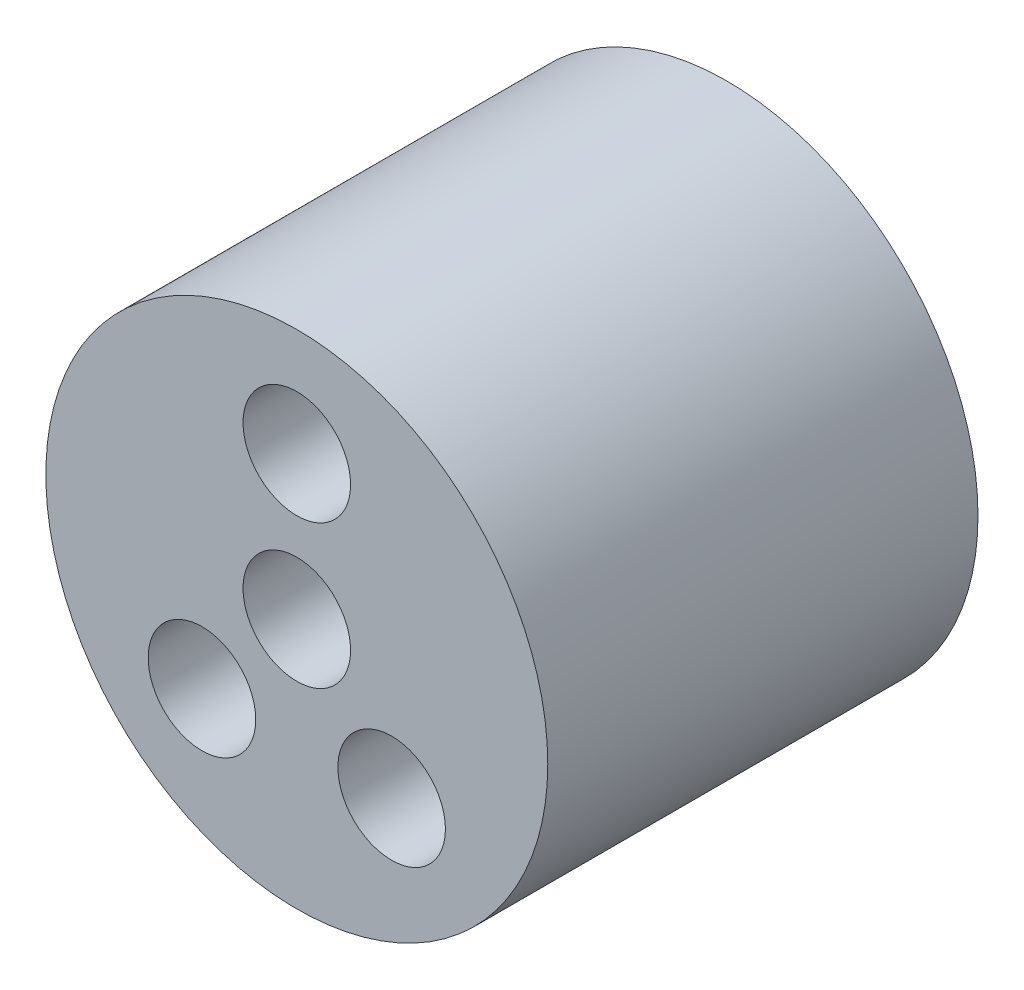
ISO-10303-21;
HEADER;
FILE_DESCRIPTION(('STEP AP214'),'2;1');
FILE_NAME('part.step','',(''),(''),'','','');
FILE_SCHEMA(('AUTOMOTIVE_DESIGN { 1 0 10303 214 1 1 1 1 }'));
ENDSEC;
DATA;
#1=APPLICATION_CONTEXT('core data for automotive mechanical design processes');
#2=APPLICATION_PROTOCOL_DEFINITION('international standard','automotive_design',2000,#1);
#3=PRODUCT_CONTEXT('',#1,'mechanical');
#4=PRODUCT('Part','Part','',(#3));
#5=PRODUCT_RELATED_PRODUCT_CATEGORY('part','',(#4));
#6=PRODUCT_DEFINITION_FORMATION('','',#4);
#7=PRODUCT_DEFINITION_CONTEXT('part definition',#1,'design');
#8=PRODUCT_DEFINITION('design','',#6,#7);
#9=PRODUCT_DEFINITION_SHAPE('','',#8);
#10=(LENGTH_UNIT() NAMED_UNIT(*) SI_UNIT(.MILLI.,.METRE.));
#11=(NAMED_UNIT(*) PLANE_ANGLE_UNIT() SI_UNIT($,.RADIAN.));
#12=(NAMED_UNIT(*) SI_UNIT($,.STERADIAN.) SOLID_ANGLE_UNIT());
#13=UNCERTAINTY_MEASURE_WITH_UNIT(LENGTH_MEASURE(1.E-05),#10,'distance_accuracy_value','');
#14=(GEOMETRIC_REPRESENTATION_CONTEXT(3) GLOBAL_UNCERTAINTY_ASSIGNED_CONTEXT((#13)) GLOBAL_UNIT_ASSIGNED_CONTEXT((#10,
#11,#12)) REPRESENTATION_CONTEXT('',''));
#15=CARTESIAN_POINT('',(0.,0.,0.));
#16=DIRECTION('',(0.,0.,1.));
#17=DIRECTION('',(1.,0.,0.));
#18=AXIS2_PLACEMENT_3D('',#15,#16,#17);
#19=CARTESIAN_POINT('',(0.,0.,240.));
#20=DIRECTION('',(0.,0.,1.));
#21=DIRECTION('',(1.,0.,0.));
#22=AXIS2_PLACEMENT_3D('',#19,#20,#21);
#23=PLANE('',#22);
#24=CARTESIAN_POINT('',(52.9150262212918,-60.,240.));
#25=DIRECTION('',(0.,0.,1.));
#26=DIRECTION('',(1.,0.,0.));
#27=AXIS2_PLACEMENT_3D('',#24,#25,#26);
#28=CIRCLE('',#27,30.);
#29=CARTESIAN_POINT('',(82.9150262212918,-60.,240.));
#30=VERTEX_POINT('',#29);
#31=EDGE_CURVE('E53',#30,#30,#28,.T.);
#32=ORIENTED_EDGE('',*,*,#31,.F.);
#33=EDGE_LOOP('',(#32));
#34=FACE_BOUND('',#33,.T.);
#35=CARTESIAN_POINT('',(0.,0.,240.));
#36=DIRECTION('',(0.,0.,1.));
#37=DIRECTION('',(1.,0.,0.));
#38=AXIS2_PLACEMENT_3D('',#35,#36,#37);
#39=CIRCLE('',#38,30.);
#40=CARTESIAN_POINT('',(30.,0.,240.));
#41=VERTEX_POINT('',#40);
#42=EDGE_CURVE('E42',#41,#41,#39,.T.);
#43=ORIENTED_EDGE('',*,*,#42,.F.);
#44=EDGE_LOOP('',(#43));
#45=FACE_BOUND('',#44,.T.);
#46=CARTESIAN_POINT('',(0.,0.,240.));
#47=DIRECTION('',(0.,0.,1.));
#48=DIRECTION('',(1.,0.,0.));
#49=AXIS2_PLACEMENT_3D('',#46,#47,#48);
#50=CIRCLE('',#49,140.);
#51=CARTESIAN_POINT('',(140.,0.,240.));
#52=VERTEX_POINT('',#51);
#53=EDGE_CURVE('E10',#52,#52,#50,.T.);
#54=ORIENTED_EDGE('',*,*,#53,.T.);
#55=EDGE_LOOP('',(#54));
#56=FACE_BOUND('',#55,.T.);
#57=CARTESIAN_POINT('',(0.,80.,240.));
#58=DIRECTION('',(0.,0.,1.));
#59=DIRECTION('',(1.,0.,0.));
#60=AXIS2_PLACEMENT_3D('',#57,#58,#59);
#61=CIRCLE('',#60,30.);
#62=CARTESIAN_POINT('',(30.,80.,240.));
#63=VERTEX_POINT('',#62);
#64=EDGE_CURVE('E47',#63,#63,#61,.T.);
#65=ORIENTED_EDGE('',*,*,#64,.F.);
#66=EDGE_LOOP('',(#65));
#67=FACE_BOUND('',#66,.T.);
#68=CARTESIAN_POINT('',(-52.9150262212918,-60.,240.));
#69=DIRECTION('',(0.,0.,1.));
#70=DIRECTION('',(1.,0.,0.));
#71=AXIS2_PLACEMENT_3D('',#68,#69,#70);
#72=CIRCLE('',#71,30.);
#73=CARTESIAN_POINT('',(-22.9150262212918,-60.,240.));
#74=VERTEX_POINT('',#73);
#75=EDGE_CURVE('E59',#74,#74,#72,.T.);
#76=ORIENTED_EDGE('',*,*,#75,.F.);
#77=EDGE_LOOP('',(#76));
#78=FACE_BOUND('',#77,.T.);
#79=ADVANCED_FACE('F31',(#34,#45,#56,#67,#78),#23,.T.);
#80=CARTESIAN_POINT('',(0.,0.,0.));
#81=DIRECTION('',(0.,0.,1.));
#82=DIRECTION('',(1.,0.,0.));
#83=AXIS2_PLACEMENT_3D('',#80,#81,#82);
#84=PLANE('',#83);
#85=CARTESIAN_POINT('',(0.,0.,0.));
#86=DIRECTION('',(0.,0.,1.));
#87=DIRECTION('',(1.,0.,0.));
#88=AXIS2_PLACEMENT_3D('',#85,#86,#87);
#89=CIRCLE('',#88,140.);
#90=CARTESIAN_POINT('',(140.,0.,0.));
#91=VERTEX_POINT('',#90);
#92=EDGE_CURVE('E35',#91,#91,#89,.T.);
#93=ORIENTED_EDGE('',*,*,#92,.F.);
#94=EDGE_LOOP('',(#93));
#95=FACE_BOUND('',#94,.T.);
#96=CARTESIAN_POINT('',(0.,0.,0.));
#97=DIRECTION('',(0.,0.,1.));
#98=DIRECTION('',(1.,0.,0.));
#99=AXIS2_PLACEMENT_3D('',#96,#97,#98);
#100=CIRCLE('',#99,30.);
#101=CARTESIAN_POINT('',(30.,0.,0.));
#102=VERTEX_POINT('',#101);
#103=EDGE_CURVE('E44',#102,#102,#100,.T.);
#104=ORIENTED_EDGE('',*,*,#103,.T.);
#105=EDGE_LOOP('',(#104));
#106=FACE_BOUND('',#105,.T.);
#107=CARTESIAN_POINT('',(0.,80.,0.));
#108=DIRECTION('',(0.,0.,1.));
#109=DIRECTION('',(1.,0.,0.));
#110=AXIS2_PLACEMENT_3D('',#107,#108,#109);
#111=CIRCLE('',#110,30.);
#112=CARTESIAN_POINT('',(30.,80.,0.));
#113=VERTEX_POINT('',#112);
#114=EDGE_CURVE('E50',#113,#113,#111,.T.);
#115=ORIENTED_EDGE('',*,*,#114,.T.);
#116=EDGE_LOOP('',(#115));
#117=FACE_BOUND('',#116,.T.);
#118=CARTESIAN_POINT('',(52.9150262212918,-60.,0.));
#119=DIRECTION('',(0.,0.,1.));
#120=DIRECTION('',(1.,0.,0.));
#121=AXIS2_PLACEMENT_3D('',#118,#119,#120);
#122=CIRCLE('',#121,30.);
#123=CARTESIAN_POINT('',(82.9150262212918,-60.,0.));
#124=VERTEX_POINT('',#123);
#125=EDGE_CURVE('E56',#124,#124,#122,.T.);
#126=ORIENTED_EDGE('',*,*,#125,.T.);
#127=EDGE_LOOP('',(#126));
#128=FACE_BOUND('',#127,.T.);
#129=CARTESIAN_POINT('',(-52.9150262212918,-60.,0.));
#130=DIRECTION('',(0.,0.,1.));
#131=DIRECTION('',(1.,0.,0.));
#132=AXIS2_PLACEMENT_3D('',#129,#130,#131);
#133=CIRCLE('',#132,30.);
#134=CARTESIAN_POINT('',(-22.9150262212918,-60.,0.));
#135=VERTEX_POINT('',#134);
#136=EDGE_CURVE('E62',#135,#135,#133,.T.);
#137=ORIENTED_EDGE('',*,*,#136,.T.);
#138=EDGE_LOOP('',(#137));
#139=FACE_BOUND('',#138,.T.);
#140=ADVANCED_FACE('F72',(#95,#106,#117,#128,#139),#84,.F.);
#141=CARTESIAN_POINT('',(0.,0.,240.));
#142=DIRECTION('',(0.,0.,-1.));
#143=DIRECTION('',(-1.,0.,0.));
#144=AXIS2_PLACEMENT_3D('',#141,#142,#143);
#145=CYLINDRICAL_SURFACE('',#144,140.);
#146=ORIENTED_EDGE('',*,*,#53,.F.);
#147=EDGE_LOOP('',(#146));
#148=FACE_BOUND('',#147,.T.);
#149=ORIENTED_EDGE('',*,*,#92,.T.);
#150=EDGE_LOOP('',(#149));
#151=FACE_BOUND('',#150,.T.);
#152=ADVANCED_FACE('F33',(#148,#151),#145,.T.);
#153=CARTESIAN_POINT('',(0.,0.,240.));
#154=DIRECTION('',(0.,0.,-1.));
#155=DIRECTION('',(-1.,0.,0.));
#156=AXIS2_PLACEMENT_3D('',#153,#154,#155);
#157=CYLINDRICAL_SURFACE('',#156,30.);
#158=ORIENTED_EDGE('',*,*,#42,.T.);
#159=EDGE_LOOP('',(#158));
#160=FACE_BOUND('',#159,.T.);
#161=ORIENTED_EDGE('',*,*,#103,.F.);
#162=EDGE_LOOP('',(#161));
#163=FACE_BOUND('',#162,.T.);
#164=ADVANCED_FACE('F82',(#160,#163),#157,.F.);
#165=CARTESIAN_POINT('',(0.,80.,240.));
#166=DIRECTION('',(0.,0.,-1.));
#167=DIRECTION('',(-1.,0.,0.));
#168=AXIS2_PLACEMENT_3D('',#165,#166,#167);
#169=CYLINDRICAL_SURFACE('',#168,30.);
#170=ORIENTED_EDGE('',*,*,#64,.T.);
#171=EDGE_LOOP('',(#170));
#172=FACE_BOUND('',#171,.T.);
#173=ORIENTED_EDGE('',*,*,#114,.F.);
#174=EDGE_LOOP('',(#173));
#175=FACE_BOUND('',#174,.T.);
#176=ADVANCED_FACE('F85',(#172,#175),#169,.F.);
#177=CARTESIAN_POINT('',(52.9150262212918,-60.,240.));
#178=DIRECTION('',(0.,0.,-1.));
#179=DIRECTION('',(-1.,0.,0.));
#180=AXIS2_PLACEMENT_3D('',#177,#178,#179);
#181=CYLINDRICAL_SURFACE('',#180,30.);
#182=ORIENTED_EDGE('',*,*,#31,.T.);
#183=EDGE_LOOP('',(#182));
#184=FACE_BOUND('',#183,.T.);
#185=ORIENTED_EDGE('',*,*,#125,.F.);
#186=EDGE_LOOP('',(#185));
#187=FACE_BOUND('',#186,.T.);
#188=ADVANCED_FACE('F89',(#184,#187),#181,.F.);
#189=CARTESIAN_POINT('',(-52.9150262212918,-60.,240.));
#190=DIRECTION('',(0.,0.,-1.));
#191=DIRECTION('',(-1.,0.,0.));
#192=AXIS2_PLACEMENT_3D('',#189,#190,#191);
#193=CYLINDRICAL_SURFACE('',#192,30.);
#194=ORIENTED_EDGE('',*,*,#75,.T.);
#195=EDGE_LOOP('',(#194));
#196=FACE_BOUND('',#195,.T.);
#197=ORIENTED_EDGE('',*,*,#136,.F.);
#198=EDGE_LOOP('',(#197));
#199=FACE_BOUND('',#198,.T.);
#200=ADVANCED_FACE('F68',(#196,#199),#193,.F.);
#201=CLOSED_SHELL('',(#79,#140,#152,#164,#176,#188,#200));
#202=MANIFOLD_SOLID_BREP('B2',#201);
#203=ADVANCED_BREP_SHAPE_REPRESENTATION('',(#18,#202),#14);
#204=SHAPE_DEFINITION_REPRESENTATION(#9,#203);
ENDSEC;
END-ISO-10303-21;
